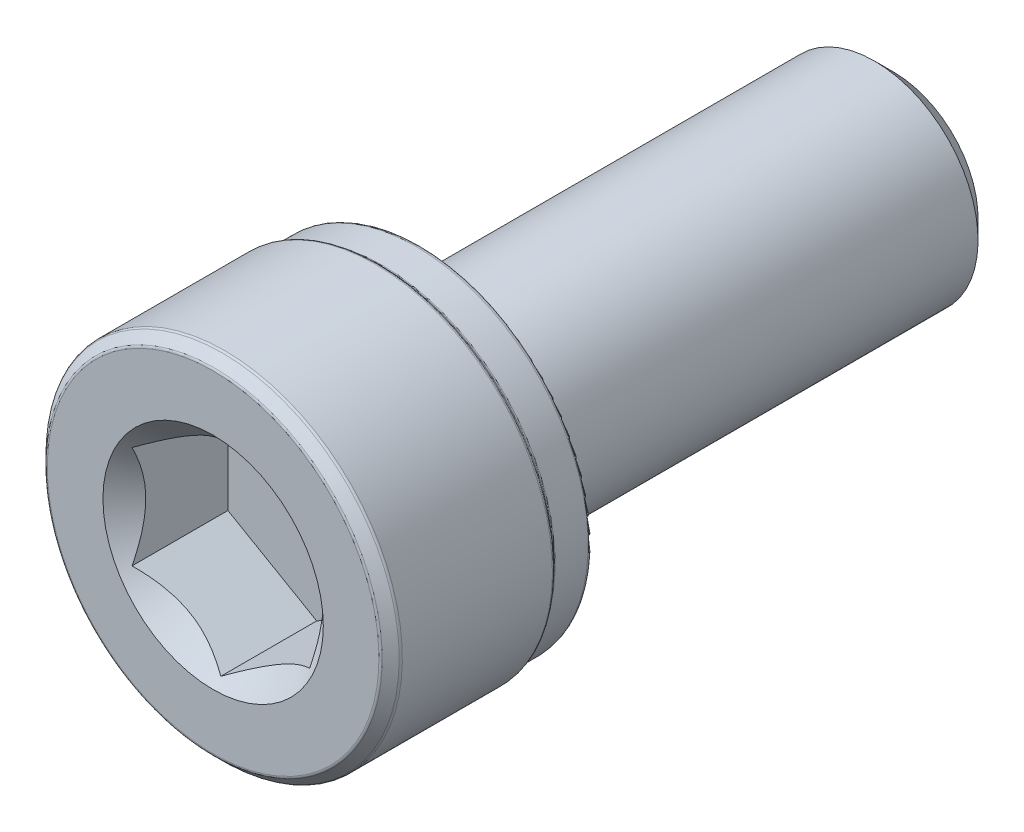
ISO-10303-21;
HEADER;
FILE_DESCRIPTION(('STEP AP214'),'2;1');
FILE_NAME('part.step','',(''),(''),'','','');
FILE_SCHEMA(('AUTOMOTIVE_DESIGN { 1 0 10303 214 1 1 1 1 }'));
ENDSEC;
DATA;
#1=APPLICATION_CONTEXT('core data for automotive mechanical design processes');
#2=APPLICATION_PROTOCOL_DEFINITION('international standard','automotive_design',2000,#1);
#3=PRODUCT_CONTEXT('',#1,'mechanical');
#4=PRODUCT('Part','Part','',(#3));
#5=PRODUCT_RELATED_PRODUCT_CATEGORY('part','',(#4));
#6=PRODUCT_DEFINITION_FORMATION('','',#4);
#7=PRODUCT_DEFINITION_CONTEXT('part definition',#1,'design');
#8=PRODUCT_DEFINITION('design','',#6,#7);
#9=PRODUCT_DEFINITION_SHAPE('','',#8);
#10=(LENGTH_UNIT() NAMED_UNIT(*) SI_UNIT(.MILLI.,.METRE.));
#11=(NAMED_UNIT(*) PLANE_ANGLE_UNIT() SI_UNIT($,.RADIAN.));
#12=(NAMED_UNIT(*) SI_UNIT($,.STERADIAN.) SOLID_ANGLE_UNIT());
#13=UNCERTAINTY_MEASURE_WITH_UNIT(LENGTH_MEASURE(1.E-05),#10,'distance_accuracy_value','');
#14=(GEOMETRIC_REPRESENTATION_CONTEXT(3) GLOBAL_UNCERTAINTY_ASSIGNED_CONTEXT((#13)) GLOBAL_UNIT_ASSIGNED_CONTEXT((#10,
#11,#12)) REPRESENTATION_CONTEXT('',''));
#15=CARTESIAN_POINT('',(0.,0.,0.));
#16=DIRECTION('',(0.,0.,1.));
#17=DIRECTION('',(1.,0.,0.));
#18=AXIS2_PLACEMENT_3D('',#15,#16,#17);
#19=CARTESIAN_POINT('',(0.,2.85048094716168,-11.5));
#20=DIRECTION('',(0.,0.,-1.));
#21=DIRECTION('',(0.,1.,0.));
#22=AXIS2_PLACEMENT_3D('',#19,#20,#21);
#23=PLANE('',#22);
#24=CARTESIAN_POINT('',(0.,0.,-11.5));
#25=DIRECTION('',(0.,0.,-1.));
#26=DIRECTION('',(0.,1.,0.));
#27=AXIS2_PLACEMENT_3D('',#24,#25,#26);
#28=CIRCLE('',#27,2.85048094716168);
#29=CARTESIAN_POINT('',(0.,2.85048094716168,-11.5));
#30=VERTEX_POINT('',#29);
#31=EDGE_CURVE('E12',#30,#30,#28,.T.);
#32=ORIENTED_EDGE('',*,*,#31,.T.);
#33=EDGE_LOOP('',(#32));
#34=FACE_BOUND('',#33,.T.);
#35=ADVANCED_FACE('F40',(#34),#23,.T.);
#36=CARTESIAN_POINT('',(0.,0.,-11.5));
#37=DIRECTION('',(0.,0.,1.));
#38=DIRECTION('',(0.,-1.,0.));
#39=AXIS2_PLACEMENT_3D('',#36,#37,#38);
#40=CONICAL_SURFACE('',#39,2.85048094716168,0.785398163397443);
#41=CARTESIAN_POINT('',(0.,0.,-10.8504809471617));
#42=DIRECTION('',(0.,0.,-1.));
#43=DIRECTION('',(0.,1.,0.));
#44=AXIS2_PLACEMENT_3D('',#41,#42,#43);
#45=CIRCLE('',#44,3.5);
#46=CARTESIAN_POINT('',(0.,3.5,-10.8504809471617));
#47=VERTEX_POINT('',#46);
#48=EDGE_CURVE('E48',#47,#47,#45,.T.);
#49=ORIENTED_EDGE('',*,*,#48,.T.);
#50=EDGE_LOOP('',(#49));
#51=FACE_BOUND('',#50,.T.);
#52=ORIENTED_EDGE('',*,*,#31,.F.);
#53=EDGE_LOOP('',(#52));
#54=FACE_BOUND('',#53,.T.);
#55=ADVANCED_FACE('F178',(#51,#54),#40,.T.);
#56=CARTESIAN_POINT('',(0.,0.,-11.5));
#57=DIRECTION('',(0.,0.,-1.));
#58=DIRECTION('',(0.,1.,0.));
#59=AXIS2_PLACEMENT_3D('',#56,#57,#58);
#60=CYLINDRICAL_SURFACE('',#59,3.5);
#61=CARTESIAN_POINT('',(0.,0.,4.15));
#62=DIRECTION('',(0.,0.,-1.));
#63=DIRECTION('',(0.,1.,0.));
#64=AXIS2_PLACEMENT_3D('',#61,#62,#63);
#65=CIRCLE('',#64,3.5);
#66=CARTESIAN_POINT('',(0.,3.5,4.15));
#67=VERTEX_POINT('',#66);
#68=EDGE_CURVE('E171',#67,#67,#65,.T.);
#69=ORIENTED_EDGE('',*,*,#68,.T.);
#70=EDGE_LOOP('',(#69));
#71=FACE_BOUND('',#70,.T.);
#72=ORIENTED_EDGE('',*,*,#48,.F.);
#73=EDGE_LOOP('',(#72));
#74=FACE_BOUND('',#73,.T.);
#75=ADVANCED_FACE('F181',(#71,#74),#60,.T.);
#76=CARTESIAN_POINT('',(0.,0.,4.15));
#77=DIRECTION('',(0.,0.,-1.));
#78=DIRECTION('',(0.,1.,0.));
#79=AXIS2_PLACEMENT_3D('',#76,#77,#78);
#80=TOROIDAL_SURFACE('',#79,3.85,0.350000000000002);
#81=CARTESIAN_POINT('',(0.,0.,4.5));
#82=DIRECTION('',(0.,0.,-1.));
#83=DIRECTION('',(0.,1.,0.));
#84=AXIS2_PLACEMENT_3D('',#81,#82,#83);
#85=CIRCLE('',#84,3.85);
#86=CARTESIAN_POINT('',(0.,3.85,4.5));
#87=VERTEX_POINT('',#86);
#88=EDGE_CURVE('E167',#87,#87,#85,.T.);
#89=ORIENTED_EDGE('',*,*,#88,.T.);
#90=EDGE_LOOP('',(#89));
#91=FACE_BOUND('',#90,.T.);
#92=ORIENTED_EDGE('',*,*,#68,.F.);
#93=EDGE_LOOP('',(#92));
#94=FACE_BOUND('',#93,.T.);
#95=ADVANCED_FACE('F183',(#91,#94),#80,.F.);
#96=CARTESIAN_POINT('',(0.,5.675,4.5));
#97=DIRECTION('',(0.,0.,-1.));
#98=DIRECTION('',(0.,1.,0.));
#99=AXIS2_PLACEMENT_3D('',#96,#97,#98);
#100=PLANE('',#99);
#101=CARTESIAN_POINT('',(0.,0.,4.5));
#102=DIRECTION('',(0.,0.,-1.));
#103=DIRECTION('',(0.,1.,0.));
#104=AXIS2_PLACEMENT_3D('',#101,#102,#103);
#105=CIRCLE('',#104,5.675);
#106=CARTESIAN_POINT('',(0.,5.675,4.5));
#107=VERTEX_POINT('',#106);
#108=EDGE_CURVE('E163',#107,#107,#105,.T.);
#109=ORIENTED_EDGE('',*,*,#108,.T.);
#110=EDGE_LOOP('',(#109));
#111=FACE_BOUND('',#110,.T.);
#112=ORIENTED_EDGE('',*,*,#88,.F.);
#113=EDGE_LOOP('',(#112));
#114=FACE_BOUND('',#113,.T.);
#115=ADVANCED_FACE('F190',(#111,#114),#100,.T.);
#116=CARTESIAN_POINT('',(0.,0.,4.65));
#117=DIRECTION('',(0.,0.,-1.));
#118=DIRECTION('',(0.,1.,0.));
#119=AXIS2_PLACEMENT_3D('',#116,#117,#118);
#120=TOROIDAL_SURFACE('',#119,5.675,0.15);
#121=CARTESIAN_POINT('',(0.,0.,4.65));
#122=DIRECTION('',(0.,0.,-1.));
#123=DIRECTION('',(0.,1.,0.));
#124=AXIS2_PLACEMENT_3D('',#121,#122,#123);
#125=CIRCLE('',#124,5.825);
#126=CARTESIAN_POINT('',(0.,5.825,4.65));
#127=VERTEX_POINT('',#126);
#128=EDGE_CURVE('E159',#127,#127,#125,.T.);
#129=ORIENTED_EDGE('',*,*,#128,.T.);
#130=EDGE_LOOP('',(#129));
#131=FACE_BOUND('',#130,.T.);
#132=ORIENTED_EDGE('',*,*,#108,.F.);
#133=EDGE_LOOP('',(#132));
#134=FACE_BOUND('',#133,.T.);
#135=ADVANCED_FACE('F221',(#131,#134),#120,.T.);
#136=CARTESIAN_POINT('',(0.,0.,-11.5));
#137=DIRECTION('',(0.,0.,-1.));
#138=DIRECTION('',(0.,1.,0.));
#139=AXIS2_PLACEMENT_3D('',#136,#137,#138);
#140=CYLINDRICAL_SURFACE('',#139,5.825);
#141=CARTESIAN_POINT('',(0.,0.,5.76719539161545));
#142=DIRECTION('',(0.,0.,-1.));
#143=DIRECTION('',(0.,1.,0.));
#144=AXIS2_PLACEMENT_3D('',#141,#142,#143);
#145=CIRCLE('',#144,5.825);
#146=CARTESIAN_POINT('',(0.,5.825,5.76719539161545));
#147=VERTEX_POINT('',#146);
#148=EDGE_CURVE('E155',#147,#147,#145,.T.);
#149=ORIENTED_EDGE('',*,*,#148,.T.);
#150=EDGE_LOOP('',(#149));
#151=FACE_BOUND('',#150,.T.);
#152=ORIENTED_EDGE('',*,*,#128,.F.);
#153=EDGE_LOOP('',(#152));
#154=FACE_BOUND('',#153,.T.);
#155=ADVANCED_FACE('F231',(#151,#154),#140,.T.);
#156=CARTESIAN_POINT('',(0.,0.,5.76719539161545));
#157=DIRECTION('',(0.,0.,-1.));
#158=DIRECTION('',(0.,1.,0.));
#159=AXIS2_PLACEMENT_3D('',#156,#157,#158);
#160=TOROIDAL_SURFACE('',#159,5.934375,0.109374999999999);
#161=CARTESIAN_POINT('',(0.,0.,5.84453519580772));
#162=DIRECTION('',(0.,0.,-1.));
#163=DIRECTION('',(0.,1.,0.));
#164=AXIS2_PLACEMENT_3D('',#161,#162,#163);
#165=CIRCLE('',#164,5.85703519580772);
#166=CARTESIAN_POINT('',(0.,5.85703519580772,5.84453519580772));
#167=VERTEX_POINT('',#166);
#168=EDGE_CURVE('E151',#167,#167,#165,.T.);
#169=ORIENTED_EDGE('',*,*,#168,.T.);
#170=EDGE_LOOP('',(#169));
#171=FACE_BOUND('',#170,.T.);
#172=ORIENTED_EDGE('',*,*,#148,.F.);
#173=EDGE_LOOP('',(#172));
#174=FACE_BOUND('',#173,.T.);
#175=ADVANCED_FACE('F241',(#171,#174),#160,.F.);
#176=CARTESIAN_POINT('',(0.,0.,5.84453519580772));
#177=DIRECTION('',(0.,0.,1.));
#178=DIRECTION('',(0.,-1.,0.));
#179=AXIS2_PLACEMENT_3D('',#176,#177,#178);
#180=CONICAL_SURFACE('',#179,5.85703519580772,0.785398163397437);
#181=CARTESIAN_POINT('',(0.,0.,5.95546480419228));
#182=DIRECTION('',(0.,0.,-1.));
#183=DIRECTION('',(0.,1.,0.));
#184=AXIS2_PLACEMENT_3D('',#181,#182,#183);
#185=CIRCLE('',#184,5.96796480419228);
#186=CARTESIAN_POINT('',(0.,5.96796480419228,5.95546480419228));
#187=VERTEX_POINT('',#186);
#188=EDGE_CURVE('E147',#187,#187,#185,.T.);
#189=ORIENTED_EDGE('',*,*,#188,.T.);
#190=EDGE_LOOP('',(#189));
#191=FACE_BOUND('',#190,.T.);
#192=ORIENTED_EDGE('',*,*,#168,.F.);
#193=EDGE_LOOP('',(#192));
#194=FACE_BOUND('',#193,.T.);
#195=ADVANCED_FACE('F251',(#191,#194),#180,.T.);
#196=CARTESIAN_POINT('',(0.,0.,6.03280460838456));
#197=DIRECTION('',(0.,0.,-1.));
#198=DIRECTION('',(0.,1.,0.));
#199=AXIS2_PLACEMENT_3D('',#196,#197,#198);
#200=TOROIDAL_SURFACE('',#199,5.890625,0.109375);
#201=CARTESIAN_POINT('',(0.,0.,6.03280460838456));
#202=DIRECTION('',(0.,0.,-1.));
#203=DIRECTION('',(0.,1.,0.));
#204=AXIS2_PLACEMENT_3D('',#201,#202,#203);
#205=CIRCLE('',#204,6.);
#206=CARTESIAN_POINT('',(0.,6.,6.03280460838456));
#207=VERTEX_POINT('',#206);
#208=EDGE_CURVE('E143',#207,#207,#205,.T.);
#209=ORIENTED_EDGE('',*,*,#208,.T.);
#210=EDGE_LOOP('',(#209));
#211=FACE_BOUND('',#210,.T.);
#212=ORIENTED_EDGE('',*,*,#188,.F.);
#213=EDGE_LOOP('',(#212));
#214=FACE_BOUND('',#213,.T.);
#215=ADVANCED_FACE('F261',(#211,#214),#200,.T.);
#216=CARTESIAN_POINT('',(0.,0.,-11.5));
#217=DIRECTION('',(0.,0.,-1.));
#218=DIRECTION('',(0.,1.,0.));
#219=AXIS2_PLACEMENT_3D('',#216,#217,#218);
#220=CYLINDRICAL_SURFACE('',#219,6.);
#221=CARTESIAN_POINT('',(0.,0.,11.1046953916154));
#222=DIRECTION('',(0.,0.,-1.));
#223=DIRECTION('',(0.,1.,0.));
#224=AXIS2_PLACEMENT_3D('',#221,#222,#223);
#225=CIRCLE('',#224,6.);
#226=CARTESIAN_POINT('',(0.,6.,11.1046953916154));
#227=VERTEX_POINT('',#226);
#228=EDGE_CURVE('E139',#227,#227,#225,.T.);
#229=ORIENTED_EDGE('',*,*,#228,.T.);
#230=EDGE_LOOP('',(#229));
#231=FACE_BOUND('',#230,.T.);
#232=ORIENTED_EDGE('',*,*,#208,.F.);
#233=EDGE_LOOP('',(#232));
#234=FACE_BOUND('',#233,.T.);
#235=ADVANCED_FACE('F271',(#231,#234),#220,.T.);
#236=CARTESIAN_POINT('',(0.,0.,11.1046953916154));
#237=DIRECTION('',(0.,0.,-1.));
#238=DIRECTION('',(0.,1.,0.));
#239=AXIS2_PLACEMENT_3D('',#236,#237,#238);
#240=TOROIDAL_SURFACE('',#239,5.890625,0.109374999999999);
#241=CARTESIAN_POINT('',(0.,0.,11.1820351958077));
#242=DIRECTION('',(0.,0.,-1.));
#243=DIRECTION('',(0.,1.,0.));
#244=AXIS2_PLACEMENT_3D('',#241,#242,#243);
#245=CIRCLE('',#244,5.96796480419228);
#246=CARTESIAN_POINT('',(0.,5.96796480419228,11.1820351958077));
#247=VERTEX_POINT('',#246);
#248=EDGE_CURVE('E135',#247,#247,#245,.T.);
#249=ORIENTED_EDGE('',*,*,#248,.T.);
#250=EDGE_LOOP('',(#249));
#251=FACE_BOUND('',#250,.T.);
#252=ORIENTED_EDGE('',*,*,#228,.F.);
#253=EDGE_LOOP('',(#252));
#254=FACE_BOUND('',#253,.T.);
#255=ADVANCED_FACE('F281',(#251,#254),#240,.T.);
#256=CARTESIAN_POINT('',(0.,0.,11.1820351958077));
#257=DIRECTION('',(0.,0.,-1.));
#258=DIRECTION('',(0.,1.,0.));
#259=AXIS2_PLACEMENT_3D('',#256,#257,#258);
#260=CONICAL_SURFACE('',#259,5.96796480419228,0.785398163397442);
#261=CARTESIAN_POINT('',(0.,0.,11.4679648041923));
#262=DIRECTION('',(0.,0.,-1.));
#263=DIRECTION('',(0.,1.,0.));
#264=AXIS2_PLACEMENT_3D('',#261,#262,#263);
#265=CIRCLE('',#264,5.68203519580772);
#266=CARTESIAN_POINT('',(0.,5.68203519580772,11.4679648041923));
#267=VERTEX_POINT('',#266);
#268=EDGE_CURVE('E131',#267,#267,#265,.T.);
#269=ORIENTED_EDGE('',*,*,#268,.T.);
#270=EDGE_LOOP('',(#269));
#271=FACE_BOUND('',#270,.T.);
#272=ORIENTED_EDGE('',*,*,#248,.F.);
#273=EDGE_LOOP('',(#272));
#274=FACE_BOUND('',#273,.T.);
#275=ADVANCED_FACE('F291',(#271,#274),#260,.T.);
#276=CARTESIAN_POINT('',(0.,0.,11.390625));
#277=DIRECTION('',(0.,0.,-1.));
#278=DIRECTION('',(0.,1.,0.));
#279=AXIS2_PLACEMENT_3D('',#276,#277,#278);
#280=TOROIDAL_SURFACE('',#279,5.60469539161544,0.109374999999999);
#281=CARTESIAN_POINT('',(0.,0.,11.5));
#282=DIRECTION('',(0.,0.,-1.));
#283=DIRECTION('',(0.,1.,0.));
#284=AXIS2_PLACEMENT_3D('',#281,#282,#283);
#285=CIRCLE('',#284,5.60469539161544);
#286=CARTESIAN_POINT('',(0.,5.60469539161544,11.5));
#287=VERTEX_POINT('',#286);
#288=EDGE_CURVE('E127',#287,#287,#285,.T.);
#289=ORIENTED_EDGE('',*,*,#288,.T.);
#290=EDGE_LOOP('',(#289));
#291=FACE_BOUND('',#290,.T.);
#292=ORIENTED_EDGE('',*,*,#268,.F.);
#293=EDGE_LOOP('',(#292));
#294=FACE_BOUND('',#293,.T.);
#295=ADVANCED_FACE('F301',(#291,#294),#280,.T.);
#296=CARTESIAN_POINT('',(0.,0.,11.5));
#297=DIRECTION('',(0.,0.,1.));
#298=DIRECTION('',(0.,-1.,0.));
#299=AXIS2_PLACEMENT_3D('',#296,#297,#298);
#300=PLANE('',#299);
#301=CARTESIAN_POINT('',(0.,0.,11.5));
#302=DIRECTION('',(0.,0.,1.));
#303=DIRECTION('',(1.,0.,0.));
#304=AXIS2_PLACEMENT_3D('',#301,#302,#303);
#305=CIRCLE('',#304,3.72390923627308);
#306=CARTESIAN_POINT('',(3.72390923627308,0.,11.5));
#307=VERTEX_POINT('',#306);
#308=EDGE_CURVE('E100',#307,#307,#305,.T.);
#309=ORIENTED_EDGE('',*,*,#308,.F.);
#310=EDGE_LOOP('',(#309));
#311=FACE_BOUND('',#310,.T.);
#312=ORIENTED_EDGE('',*,*,#288,.F.);
#313=EDGE_LOOP('',(#312));
#314=FACE_BOUND('',#313,.T.);
#315=ADVANCED_FACE('F311',(#311,#314),#300,.T.);
#316=CARTESIAN_POINT('',(0.,0.,11.5));
#317=DIRECTION('',(0.,0.,1.));
#318=DIRECTION('',(1.,0.,0.));
#319=AXIS2_PLACEMENT_3D('',#316,#317,#318);
#320=CONICAL_SURFACE('',#319,3.72390923627308,0.78539816339745);
#321=ORIENTED_EDGE('',*,*,#308,.T.);
#322=EDGE_LOOP('',(#321));
#323=FACE_BOUND('',#322,.T.);
#324=CARTESIAN_POINT('',(-3.0002,-1.73193533751504,11.2403078546918));
#325=CARTESIAN_POINT('',(-2.89707648504425,-1.79147372663452,11.1808206971865));
#326=CARTESIAN_POINT('',(-2.79222861066935,-1.85200767512883,11.1248273583302));
#327=CARTESIAN_POINT('',(-2.5784323282189,-1.97544301635334,11.0223049752436));
#328=CARTESIAN_POINT('',(-2.46946358862023,-2.03835614749388,10.975832972606));
#329=CARTESIAN_POINT('',(-2.24973336040297,-2.16521745390422,10.896225567381));
#330=CARTESIAN_POINT('',(-2.13902782823778,-2.22913332270056,10.8628900795073));
#331=CARTESIAN_POINT('',(-1.91517958943467,-2.35837216363117,10.811529922844));
#332=CARTESIAN_POINT('',(-1.802043720793,-2.42369118784644,10.7934669164003));
#333=CARTESIAN_POINT('',(-1.60705904380729,-2.53626564359199,10.7771692873152));
#334=CARTESIAN_POINT('',(-1.52546204599786,-2.58337569224233,10.7747567460385));
#335=CARTESIAN_POINT('',(-1.3624007711699,-2.67751916315865,10.7788218135218));
#336=CARTESIAN_POINT('',(-1.28093655070101,-2.72455255277569,10.785302538893));
#337=CARTESIAN_POINT('',(-1.11877988766162,-2.81817374583237,10.8067841013799));
#338=CARTESIAN_POINT('',(-1.03808841121569,-2.86476099147974,10.8217944688319));
#339=CARTESIAN_POINT('',(-0.878091302108659,-2.95713536549225,10.8595160249307));
#340=CARTESIAN_POINT('',(-0.798785563690698,-3.00292255491614,10.8822266231875));
#341=CARTESIAN_POINT('',(-0.657993859197242,-3.0842086834051,10.9289530637186));
#342=CARTESIAN_POINT('',(-0.596196277853969,-3.11988753362891,10.9517407065455));
#343=CARTESIAN_POINT('',(-0.473710582479776,-3.19060468282508,11.0009886649221));
#344=CARTESIAN_POINT('',(-0.413022502364393,-3.22564296221629,11.0274490925309));
#345=CARTESIAN_POINT('',(-0.292947002609134,-3.29496858432307,11.083449373256));
#346=CARTESIAN_POINT('',(-0.233556167704079,-3.3292578988429,11.112979543343));
#347=CARTESIAN_POINT('',(-0.115874438532729,-3.39720147685868,11.1747314704402));
#348=CARTESIAN_POINT('',(-0.0575828957522637,-3.43085611477446,11.206951575524));
#349=CARTESIAN_POINT('',(0.00020000000000167,-3.46421708519159,11.2403078546918));
#350=B_SPLINE_CURVE_WITH_KNOTS('',3,(#324,#325,#326,#327,#328,#329,#330,#331,#332,#333,#334,
#335,#336,#337,#338,#339,#340,#341,#342,#343,#344,#345,#346,#347,#348,#349),.UNSPECIFIED.,.F.,
.F.,(4,2,2,2,2,2,2,2,2,2,2,2,4),(0.,0.399603557139307,0.801535286397846,1.19708369162343,
1.59163620080173,1.87398941755844,2.15644160919093,2.43921001247425,2.72195674032138,
2.94657516661927,3.17120044767274,3.3951375283781,3.61893808380739),.UNSPECIFIED.);
#351=CARTESIAN_POINT('',(-3.,-1.73205080756887,11.2401923788647));
#352=VERTEX_POINT('',#351);
#353=CARTESIAN_POINT('',(0.,-3.46410161513775,11.2401923788647));
#354=VERTEX_POINT('',#353);
#355=EDGE_CURVE('E108',#352,#354,#350,.T.);
#356=ORIENTED_EDGE('',*,*,#355,.F.);
#357=CARTESIAN_POINT('',(-3.,-3.65868502692184,12.5074728161744));
#358=CARTESIAN_POINT('',(-3.,-3.57046001434659,12.4392654022356));
#359=CARTESIAN_POINT('',(-3.,-3.48176466824411,12.3716568866961));
#360=CARTESIAN_POINT('',(-3.,-3.30323929172792,12.2379127141258));
#361=CARTESIAN_POINT('',(-3.,-3.21340900193022,12.1717774036907));
#362=CARTESIAN_POINT('',(-3.,-3.03176386710967,12.04078425691));
#363=CARTESIAN_POINT('',(-3.,-2.93993906622249,11.9759401814366));
#364=CARTESIAN_POINT('',(-3.,-2.75477001311512,11.8484666510655));
#365=CARTESIAN_POINT('',(-3.,-2.66142586552539,11.7858370446016));
#366=CARTESIAN_POINT('',(-3.,-2.4668197301681,11.6593084792421));
#367=CARTESIAN_POINT('',(-3.,-2.36543808558168,11.5955926371686));
#368=CARTESIAN_POINT('',(-3.,-2.16029134446498,11.4720547356373));
#369=CARTESIAN_POINT('',(-3.,-2.05652584459888,11.4122333417624));
#370=CARTESIAN_POINT('',(-3.,-1.84657278864411,11.2977536369836));
#371=CARTESIAN_POINT('',(-3.,-1.74039355395929,11.243080184106));
#372=CARTESIAN_POINT('',(-3.,-1.52500620692437,11.1401214423672));
#373=CARTESIAN_POINT('',(-3.,-1.41579956866436,11.0918331083544));
#374=CARTESIAN_POINT('',(-3.,-1.20555018350108,11.0079710827069));
#375=CARTESIAN_POINT('',(-3.,-1.10482901625482,10.9715993284052));
#376=CARTESIAN_POINT('',(-3.,-0.900782966121197,10.9069144236256));
#377=CARTESIAN_POINT('',(-3.,-0.797457921027949,10.878601776539));
#378=CARTESIAN_POINT('',(-3.,-0.590643649276323,10.8320553377726));
#379=CARTESIAN_POINT('',(-3.,-0.487196993252259,10.8136356037351));
#380=CARTESIAN_POINT('',(-3.,-0.27897031248833,10.7872658158374));
#381=CARTESIAN_POINT('',(-3.,-0.174190583554851,10.7793134788245));
#382=CARTESIAN_POINT('',(-3.,0.0308085290515859,10.7745791049118));
#383=CARTESIAN_POINT('',(-3.,0.131016524095698,10.7773011930421));
#384=CARTESIAN_POINT('',(-3.,0.330669341657684,10.7926169386191));
#385=CARTESIAN_POINT('',(-3.,0.430114095513744,10.8052114739277));
#386=CARTESIAN_POINT('',(-3.,0.629211173128045,10.8397663264938));
#387=CARTESIAN_POINT('',(-3.,0.728834054007884,10.8618936597452));
#388=CARTESIAN_POINT('',(-3.,0.925868222371533,10.9142769115155));
#389=CARTESIAN_POINT('',(-3.,1.02327961830608,10.9445324304921));
#390=CARTESIAN_POINT('',(-3.,1.32135884485001,11.0487225128153));
#391=CARTESIAN_POINT('',(-3.,1.51802051003283,11.1341523863885));
#392=CARTESIAN_POINT('',(-3.,1.80585609935241,11.2766873101988));
#393=CARTESIAN_POINT('',(-3.,1.90078404091317,11.3267074055041));
#394=CARTESIAN_POINT('',(-3.,2.08849313613445,11.4306342448877));
#395=CARTESIAN_POINT('',(-3.,2.18127466149529,11.4845403092663));
#396=CARTESIAN_POINT('',(-3.,2.36041110373359,11.5927256823976));
#397=CARTESIAN_POINT('',(-3.,2.44685732002799,11.646855513939));
#398=CARTESIAN_POINT('',(-3.,2.61826626313253,11.7574261728339));
#399=CARTESIAN_POINT('',(-3.,2.70322887833781,11.8138671729874));
#400=CARTESIAN_POINT('',(-3.,2.87118087576364,11.9281888330549));
#401=CARTESIAN_POINT('',(-3.,2.95418061060259,11.9860543468003));
#402=CARTESIAN_POINT('',(-3.,3.11904059542994,12.1033407654459));
#403=CARTESIAN_POINT('',(-3.,3.20090115330639,12.162761237067));
#404=CARTESIAN_POINT('',(-3.,3.28228390975415,12.2228185116592));
#405=B_SPLINE_CURVE_WITH_KNOTS('',3,(#357,#358,#359,#360,#361,#362,#363,#364,#365,#366,#367,
#368,#369,#370,#371,#372,#373,#374,#375,#376,#377,#378,#379,#380,#381,#382,#383,#384,#385,#386,
#387,#388,#389,#390,#391,#392,#393,#394,#395,#396,#397,#398,#399,#400,#401,#402,#403,#404),
.UNSPECIFIED.,.F.,.F.,(4,2,2,2,2,2,2,2,2,2,2,2,2,2,2,2,2,2,2,2,2,2,2,4),(0.,0.334555166391488,
0.669188228361208,1.00639842533175,1.34358549761277,1.70273944448279,2.06195461248973,
2.42007783772557,2.77802964825103,3.09901554007012,3.420021477043,3.7347616972365,
4.04943325478864,4.34966403239456,4.64992150966994,4.95566830287767,5.26140006979961,
5.90266544708056,6.22453811891991,6.54635462757108,6.85230229494454,7.15827287913397,
7.46179352227316,7.7652304734124),.UNSPECIFIED.);
#406=CARTESIAN_POINT('',(-3.,1.73205080756887,11.2401923788647));
#407=VERTEX_POINT('',#406);
#408=EDGE_CURVE('E435',#407,#352,#405,.F.);
#409=ORIENTED_EDGE('',*,*,#408,.F.);
#410=CARTESIAN_POINT('',(0.000200000000000959,3.46421708519159,11.2403078546918));
#411=CARTESIAN_POINT('',(-0.102923514955748,3.40467869607211,11.1808206971865));
#412=CARTESIAN_POINT('',(-0.20777138933065,3.3441447475778,11.1248273583302));
#413=CARTESIAN_POINT('',(-0.421567671781096,3.22070940635329,11.0223049752436));
#414=CARTESIAN_POINT('',(-0.53053641137976,3.15779627521275,10.975832972606));
#415=CARTESIAN_POINT('',(-0.750266639597028,3.03093496880241,10.896225567381));
#416=CARTESIAN_POINT('',(-0.860972171762212,2.96701910000606,10.8628900795073));
#417=CARTESIAN_POINT('',(-1.08482041056533,2.83778025907546,10.811529922844));
#418=CARTESIAN_POINT('',(-1.19795627920699,2.77246123486019,10.7934669164003));
#419=CARTESIAN_POINT('',(-1.3929409561927,2.65988677911464,10.7771692873152));
#420=CARTESIAN_POINT('',(-1.47453795400213,2.6127767304643,10.7747567460385));
#421=CARTESIAN_POINT('',(-1.63759922883009,2.51863325954797,10.7788218135218));
#422=CARTESIAN_POINT('',(-1.71906344929899,2.47159986993093,10.785302538893));
#423=CARTESIAN_POINT('',(-1.88122011233837,2.37797867687425,10.8067841013799));
#424=CARTESIAN_POINT('',(-1.9619115887843,2.33139143122689,10.8217944688319));
#425=CARTESIAN_POINT('',(-2.12190869789134,2.23901705721438,10.8595160249307));
#426=CARTESIAN_POINT('',(-2.2012144363093,2.19322986779049,10.8822266231875));
#427=CARTESIAN_POINT('',(-2.34200614080275,2.11194373930152,10.9289530637186));
#428=CARTESIAN_POINT('',(-2.40380372214603,2.07626488907772,10.9517407065455));
#429=CARTESIAN_POINT('',(-2.52628941752022,2.00554773988155,11.0009886649221));
#430=CARTESIAN_POINT('',(-2.5869774976356,1.97050946049033,11.0274490925309));
#431=CARTESIAN_POINT('',(-2.70705299739086,1.90118383838355,11.083449373256));
#432=CARTESIAN_POINT('',(-2.76644383229592,1.86689452386372,11.112979543343));
#433=CARTESIAN_POINT('',(-2.88412556146727,1.79895094584794,11.1747314704402));
#434=CARTESIAN_POINT('',(-2.94241710424773,1.76529630793216,11.206951575524));
#435=CARTESIAN_POINT('',(-3.0002,1.73193533751504,11.2403078546918));
#436=B_SPLINE_CURVE_WITH_KNOTS('',3,(#410,#411,#412,#413,#414,#415,#416,#417,#418,#419,#420,
#421,#422,#423,#424,#425,#426,#427,#428,#429,#430,#431,#432,#433,#434,#435),.UNSPECIFIED.,.F.,
.F.,(4,2,2,2,2,2,2,2,2,2,2,2,4),(0.,0.399603557139307,0.801535286397846,1.19708369162343,
1.59163620080173,1.87398941755844,2.15644160919093,2.43921001247425,2.72195674032138,
2.94657516661927,3.17120044767274,3.3951375283781,3.61893808380739),.UNSPECIFIED.);
#437=CARTESIAN_POINT('',(0.,3.46410161513775,11.2401923788647));
#438=VERTEX_POINT('',#437);
#439=EDGE_CURVE('E430',#438,#407,#436,.T.);
#440=ORIENTED_EDGE('',*,*,#439,.F.);
#441=CARTESIAN_POINT('',(3.0002,1.73193533751504,11.2403078546918));
#442=CARTESIAN_POINT('',(2.89707648504425,1.79147372663452,11.1808206971865));
#443=CARTESIAN_POINT('',(2.79222861066935,1.85200767512883,11.1248273583302));
#444=CARTESIAN_POINT('',(2.5784323282189,1.97544301635334,11.0223049752436));
#445=CARTESIAN_POINT('',(2.46946358862024,2.03835614749388,10.975832972606));
#446=CARTESIAN_POINT('',(2.24973336040297,2.16521745390422,10.896225567381));
#447=CARTESIAN_POINT('',(2.13902782823779,2.22913332270057,10.8628900795073));
#448=CARTESIAN_POINT('',(1.91517958943467,2.35837216363117,10.811529922844));
#449=CARTESIAN_POINT('',(1.802043720793,2.42369118784644,10.7934669164003));
#450=CARTESIAN_POINT('',(1.60705904380729,2.53626564359199,10.7771692873152));
#451=CARTESIAN_POINT('',(1.52546204599786,2.58337569224233,10.7747567460385));
#452=CARTESIAN_POINT('',(1.36240077116991,2.67751916315865,10.7788218135218));
#453=CARTESIAN_POINT('',(1.28093655070101,2.7245525527757,10.785302538893));
#454=CARTESIAN_POINT('',(1.11877988766163,2.81817374583237,10.8067841013799));
#455=CARTESIAN_POINT('',(1.03808841121569,2.86476099147974,10.821794468832));
#456=CARTESIAN_POINT('',(0.878091302108661,2.95713536549225,10.8595160249307));
#457=CARTESIAN_POINT('',(0.7987855636907,3.00292255491614,10.8822266231875));
#458=CARTESIAN_POINT('',(0.657993859197243,3.0842086834051,10.9289530637186));
#459=CARTESIAN_POINT('',(0.596196277853971,3.11988753362891,10.9517407065455));
#460=CARTESIAN_POINT('',(0.473710582479778,3.19060468282508,11.0009886649221));
#461=CARTESIAN_POINT('',(0.413022502364394,3.2256429622163,11.0274490925309));
#462=CARTESIAN_POINT('',(0.292947002609136,3.29496858432307,11.083449373256));
#463=CARTESIAN_POINT('',(0.233556167704081,3.3292578988429,11.112979543343));
#464=CARTESIAN_POINT('',(0.115874438532732,3.39720147685868,11.1747314704402));
#465=CARTESIAN_POINT('',(0.057582895752267,3.43085611477446,11.206951575524));
#466=CARTESIAN_POINT('',(-0.000199999999998207,3.46421708519159,11.2403078546918));
#467=B_SPLINE_CURVE_WITH_KNOTS('',3,(#441,#442,#443,#444,#445,#446,#447,#448,#449,#450,#451,
#452,#453,#454,#455,#456,#457,#458,#459,#460,#461,#462,#463,#464,#465,#466),.UNSPECIFIED.,.F.,
.F.,(4,2,2,2,2,2,2,2,2,2,2,2,4),(0.,0.399603557139308,0.801535286397848,1.19708369162343,
1.59163620080173,1.87398941755845,2.15644160919093,2.43921001247426,2.72195674032138,
2.94657516661927,3.17120044767275,3.3951375283781,3.61893808380739),.UNSPECIFIED.);
#468=CARTESIAN_POINT('',(3.,1.73205080756888,11.2401923788647));
#469=VERTEX_POINT('',#468);
#470=EDGE_CURVE('E55',#469,#438,#467,.T.);
#471=ORIENTED_EDGE('',*,*,#470,.F.);
#472=CARTESIAN_POINT('',(3.,-3.65868568542365,12.507473325381));
#473=CARTESIAN_POINT('',(3.,-3.57046065370778,12.4392658917112));
#474=CARTESIAN_POINT('',(3.,-3.48176528840875,12.3716573564685));
#475=CARTESIAN_POINT('',(3.,-3.30323987331902,12.2379131446039));
#476=CARTESIAN_POINT('',(3.,-3.21340956414427,12.1717778145777));
#477=CARTESIAN_POINT('',(3.,-3.03176438993655,12.0407846284677));
#478=CARTESIAN_POINT('',(3.,-2.93993956903388,11.9759405332623));
#479=CARTESIAN_POINT('',(3.,-2.75477047555453,11.8484669637312));
#480=CARTESIAN_POINT('',(3.,-2.66142630760835,11.7858373378394));
#481=CARTESIAN_POINT('',(3.,-2.4668201282923,11.6593087319058));
#482=CARTESIAN_POINT('',(3.,-2.36543846004299,11.5955928687615));
#483=CARTESIAN_POINT('',(3.,-2.16029167076655,11.472054926036));
#484=CARTESIAN_POINT('',(3.,-2.05652614640319,11.4122335120383));
#485=CARTESIAN_POINT('',(3.,-1.8465730405795,11.2977537686578));
#486=CARTESIAN_POINT('',(3.,-1.74039378053025,11.2430802972896));
#487=CARTESIAN_POINT('',(3.,-1.52500638138399,11.1401215208862));
#488=CARTESIAN_POINT('',(3.,-1.41579971637871,11.0918331706963));
#489=CARTESIAN_POINT('',(3.,-1.20555032006933,11.0079711341128));
#490=CARTESIAN_POINT('',(3.,-1.10482916967515,10.9715993819958));
#491=CARTESIAN_POINT('',(3.,-0.90078315391948,10.9069144782102));
#492=CARTESIAN_POINT('',(3.,-0.797458126351431,10.8786018299348));
#493=CARTESIAN_POINT('',(3.,-0.590643889129612,10.8320553847186));
#494=CARTESIAN_POINT('',(3.,-0.487197250095804,10.8136356455382));
#495=CARTESIAN_POINT('',(3.,-0.27897060288237,10.7872658433507));
#496=CARTESIAN_POINT('',(3.,-0.174190890509143,10.7793134971926));
#497=CARTESIAN_POINT('',(3.,0.0308081943873898,10.7745791018755));
#498=CARTESIAN_POINT('',(3.,0.131016178238977,10.7773011782611));
#499=CARTESIAN_POINT('',(3.,0.330668974714498,10.7926168987136));
#500=CARTESIAN_POINT('',(3.,0.430113718676848,10.8052114206408));
#501=CARTESIAN_POINT('',(3.,0.629210776765425,10.8397662453486));
#502=CARTESIAN_POINT('',(3.,0.728833648050105,10.8618935640327));
#503=CARTESIAN_POINT('',(3.,0.925867798281236,10.9142767865526));
#504=CARTESIAN_POINT('',(3.,1.02327918567827,10.9445322908464));
#505=CARTESIAN_POINT('',(3.,1.32135832078604,11.0487223052458));
#506=CARTESIAN_POINT('',(3.,1.51801990763497,11.1341521165491));
#507=CARTESIAN_POINT('',(3.,1.8058553841991,11.2766869418376));
#508=CARTESIAN_POINT('',(3.,1.90078328883735,11.3267070033408));
#509=CARTESIAN_POINT('',(3.,2.08849231140504,11.4306337740223));
#510=CARTESIAN_POINT('',(3.,2.18127380103436,11.4845398035015));
#511=CARTESIAN_POINT('',(3.,2.36041017845484,11.5927251104002));
#512=CARTESIAN_POINT('',(3.,2.44685636554216,11.6468549107682));
#513=CARTESIAN_POINT('',(3.,2.61826525065149,11.7574255071813));
#514=CARTESIAN_POINT('',(3.,2.70322783706868,11.8138664760264));
#515=CARTESIAN_POINT('',(3.,2.87117977762098,11.9281880738328));
#516=CARTESIAN_POINT('',(3.,2.95417948436934,11.9860535566299));
#517=CARTESIAN_POINT('',(3.,3.11903941320167,12.1033399134182));
#518=CARTESIAN_POINT('',(3.,3.20089994317372,12.1627603541304));
#519=CARTESIAN_POINT('',(3.,3.28228267176515,12.2228175978567));
#520=B_SPLINE_CURVE_WITH_KNOTS('',3,(#472,#473,#474,#475,#476,#477,#478,#479,#480,#481,#482,
#483,#484,#485,#486,#487,#488,#489,#490,#491,#492,#493,#494,#495,#496,#497,#498,#499,#500,#501,
#502,#503,#504,#505,#506,#507,#508,#509,#510,#511,#512,#513,#514,#515,#516,#517,#518,#519),
.UNSPECIFIED.,.F.,.F.,(4,2,2,2,2,2,2,2,2,2,2,2,2,2,2,2,2,2,2,2,2,2,2,4),(0.,0.33455524802587,
0.669188391653858,1.00639867181903,1.3435858272818,1.70273986787676,2.06195512966582,
2.42007844788624,2.77803035123907,3.09901619346749,3.42002208093526,3.73476225395386,
4.04943376435917,4.34966450759512,4.64992195045385,4.95566870609693,5.26140043546953,
5.90266552412361,6.22453805065167,6.54635441405245,6.85230195751929,7.1582724177938,
7.46179293869819,7.76522976761318),.UNSPECIFIED.);
#521=CARTESIAN_POINT('',(3.,-1.73205080756887,11.2401923788647));
#522=VERTEX_POINT('',#521);
#523=EDGE_CURVE('E92',#522,#469,#520,.T.);
#524=ORIENTED_EDGE('',*,*,#523,.F.);
#525=CARTESIAN_POINT('',(-0.000199999999998448,-3.46421708519159,11.2403078546918));
#526=CARTESIAN_POINT('',(0.10292351495575,-3.40467869607211,11.1808206971865));
#527=CARTESIAN_POINT('',(0.207771389330652,-3.3441447475778,11.1248273583302));
#528=CARTESIAN_POINT('',(0.421567671781098,-3.22070940635329,11.0223049752436));
#529=CARTESIAN_POINT('',(0.530536411379762,-3.15779627521275,10.975832972606));
#530=CARTESIAN_POINT('',(0.75026663959703,-3.03093496880241,10.896225567381));
#531=CARTESIAN_POINT('',(0.860972171762213,-2.96701910000606,10.8628900795073));
#532=CARTESIAN_POINT('',(1.08482041056533,-2.83778025907546,10.811529922844));
#533=CARTESIAN_POINT('',(1.19795627920699,-2.77246123486019,10.7934669164003));
#534=CARTESIAN_POINT('',(1.3929409561927,-2.65988677911464,10.7771692873152));
#535=CARTESIAN_POINT('',(1.47453795400214,-2.6127767304643,10.7747567460385));
#536=CARTESIAN_POINT('',(1.63759922883009,-2.51863325954797,10.7788218135218));
#537=CARTESIAN_POINT('',(1.71906344929899,-2.47159986993093,10.785302538893));
#538=CARTESIAN_POINT('',(1.88122011233837,-2.37797867687425,10.8067841013799));
#539=CARTESIAN_POINT('',(1.9619115887843,-2.33139143122689,10.8217944688319));
#540=CARTESIAN_POINT('',(2.12190869789134,-2.23901705721438,10.8595160249307));
#541=CARTESIAN_POINT('',(2.2012144363093,-2.19322986779049,10.8822266231875));
#542=CARTESIAN_POINT('',(2.34200614080275,-2.11194373930152,10.9289530637186));
#543=CARTESIAN_POINT('',(2.40380372214603,-2.07626488907772,10.9517407065455));
#544=CARTESIAN_POINT('',(2.52628941752022,-2.00554773988155,11.0009886649221));
#545=CARTESIAN_POINT('',(2.5869774976356,-1.97050946049033,11.0274490925309));
#546=CARTESIAN_POINT('',(2.70705299739086,-1.90118383838355,11.083449373256));
#547=CARTESIAN_POINT('',(2.76644383229592,-1.86689452386372,11.112979543343));
#548=CARTESIAN_POINT('',(2.88412556146727,-1.79895094584794,11.1747314704402));
#549=CARTESIAN_POINT('',(2.94241710424774,-1.76529630793216,11.206951575524));
#550=CARTESIAN_POINT('',(3.0002,-1.73193533751503,11.2403078546918));
#551=B_SPLINE_CURVE_WITH_KNOTS('',3,(#525,#526,#527,#528,#529,#530,#531,#532,#533,#534,#535,
#536,#537,#538,#539,#540,#541,#542,#543,#544,#545,#546,#547,#548,#549,#550),.UNSPECIFIED.,.F.,
.F.,(4,2,2,2,2,2,2,2,2,2,2,2,4),(0.,0.399603557139306,0.801535286397845,1.19708369162343,
1.59163620080173,1.87398941755844,2.15644160919093,2.43921001247425,2.72195674032138,
2.94657516661927,3.17120044767274,3.3951375283781,3.61893808380739),.UNSPECIFIED.);
#552=EDGE_CURVE('E95',#354,#522,#551,.T.);
#553=ORIENTED_EDGE('',*,*,#552,.F.);
#554=EDGE_LOOP('',(#356,#409,#440,#471,#524,#553));
#555=FACE_BOUND('',#554,.T.);
#556=ADVANCED_FACE('F94',(#323,#555),#320,.F.);
#557=CARTESIAN_POINT('',(0.,0.,8.));
#558=DIRECTION('',(0.,0.,1.));
#559=DIRECTION('',(1.,0.,0.));
#560=AXIS2_PLACEMENT_3D('',#557,#558,#559);
#561=PLANE('',#560);
#562=DIRECTION('',(0.866025403784438,0.5,0.));
#563=VECTOR('',#562,1.);
#564=CARTESIAN_POINT('',(0.,-3.46410161513775,8.));
#565=LINE('',#564,#563);
#566=CARTESIAN_POINT('',(0.,-3.46410161513775,8.));
#567=VERTEX_POINT('',#566);
#568=CARTESIAN_POINT('',(3.,-1.73205080756887,8.));
#569=VERTEX_POINT('',#568);
#570=EDGE_CURVE('E107',#567,#569,#565,.T.);
#571=ORIENTED_EDGE('',*,*,#570,.T.);
#572=DIRECTION('',(0.,1.,0.));
#573=VECTOR('',#572,1.);
#574=CARTESIAN_POINT('',(3.,-1.73205080756887,8.));
#575=LINE('',#574,#573);
#576=CARTESIAN_POINT('',(3.,1.73205080756888,8.));
#577=VERTEX_POINT('',#576);
#578=EDGE_CURVE('E112',#569,#577,#575,.T.);
#579=ORIENTED_EDGE('',*,*,#578,.T.);
#580=DIRECTION('',(-0.866025403784439,0.5,0.));
#581=VECTOR('',#580,1.);
#582=CARTESIAN_POINT('',(3.,1.73205080756888,8.));
#583=LINE('',#582,#581);
#584=CARTESIAN_POINT('',(0.,3.46410161513775,8.));
#585=VERTEX_POINT('',#584);
#586=EDGE_CURVE('E473',#577,#585,#583,.T.);
#587=ORIENTED_EDGE('',*,*,#586,.T.);
#588=DIRECTION('',(-0.866025403784438,-0.5,0.));
#589=VECTOR('',#588,1.);
#590=CARTESIAN_POINT('',(0.,3.46410161513775,8.));
#591=LINE('',#590,#589);
#592=CARTESIAN_POINT('',(-3.,1.73205080756887,8.));
#593=VERTEX_POINT('',#592);
#594=EDGE_CURVE('E456',#585,#593,#591,.T.);
#595=ORIENTED_EDGE('',*,*,#594,.T.);
#596=DIRECTION('',(0.,-1.,0.));
#597=VECTOR('',#596,1.);
#598=CARTESIAN_POINT('',(-3.,1.73205080756887,8.));
#599=LINE('',#598,#597);
#600=CARTESIAN_POINT('',(-3.,-1.73205080756888,8.));
#601=VERTEX_POINT('',#600);
#602=EDGE_CURVE('E123',#593,#601,#599,.T.);
#603=ORIENTED_EDGE('',*,*,#602,.T.);
#604=DIRECTION('',(0.866025403784439,-0.5,0.));
#605=VECTOR('',#604,1.);
#606=CARTESIAN_POINT('',(-3.,-1.73205080756888,8.));
#607=LINE('',#606,#605);
#608=EDGE_CURVE('E116',#601,#567,#607,.T.);
#609=ORIENTED_EDGE('',*,*,#608,.T.);
#610=EDGE_LOOP('',(#571,#579,#587,#595,#603,#609));
#611=FACE_BOUND('',#610,.T.);
#612=ADVANCED_FACE('F331',(#611),#561,.T.);
#613=CARTESIAN_POINT('',(3.,-1.73205080756887,8.));
#614=DIRECTION('',(1.,0.,0.));
#615=DIRECTION('',(0.,1.,0.));
#616=AXIS2_PLACEMENT_3D('',#613,#614,#615);
#617=PLANE('',#616);
#618=DIRECTION('',(0.,0.,1.));
#619=VECTOR('',#618,1.);
#620=CARTESIAN_POINT('',(3.,-1.73205080756887,8.));
#621=LINE('',#620,#619);
#622=EDGE_CURVE('E104',#569,#522,#621,.T.);
#623=ORIENTED_EDGE('',*,*,#622,.T.);
#624=ORIENTED_EDGE('',*,*,#523,.T.);
#625=DIRECTION('',(0.,0.,1.));
#626=VECTOR('',#625,1.);
#627=CARTESIAN_POINT('',(3.,1.73205080756888,8.));
#628=LINE('',#627,#626);
#629=EDGE_CURVE('E115',#577,#469,#628,.T.);
#630=ORIENTED_EDGE('',*,*,#629,.F.);
#631=ORIENTED_EDGE('',*,*,#578,.F.);
#632=EDGE_LOOP('',(#623,#624,#630,#631));
#633=FACE_BOUND('',#632,.T.);
#634=ADVANCED_FACE('F110',(#633),#617,.F.);
#635=CARTESIAN_POINT('',(3.,1.73205080756888,8.));
#636=DIRECTION('',(0.5,0.866025403784439,0.));
#637=DIRECTION('',(-0.866025403784439,0.5,0.));
#638=AXIS2_PLACEMENT_3D('',#635,#636,#637);
#639=PLANE('',#638);
#640=ORIENTED_EDGE('',*,*,#629,.T.);
#641=ORIENTED_EDGE('',*,*,#470,.T.);
#642=DIRECTION('',(0.,0.,1.));
#643=VECTOR('',#642,1.);
#644=CARTESIAN_POINT('',(0.,3.46410161513775,8.));
#645=LINE('',#644,#643);
#646=EDGE_CURVE('E120',#585,#438,#645,.T.);
#647=ORIENTED_EDGE('',*,*,#646,.F.);
#648=ORIENTED_EDGE('',*,*,#586,.F.);
#649=EDGE_LOOP('',(#640,#641,#647,#648));
#650=FACE_BOUND('',#649,.T.);
#651=ADVANCED_FACE('F350',(#650),#639,.F.);
#652=CARTESIAN_POINT('',(0.,3.46410161513775,8.));
#653=DIRECTION('',(-0.5,0.866025403784438,0.));
#654=DIRECTION('',(-0.866025403784439,-0.5,0.));
#655=AXIS2_PLACEMENT_3D('',#652,#653,#654);
#656=PLANE('',#655);
#657=ORIENTED_EDGE('',*,*,#646,.T.);
#658=ORIENTED_EDGE('',*,*,#439,.T.);
#659=DIRECTION('',(0.,0.,1.));
#660=VECTOR('',#659,1.);
#661=CARTESIAN_POINT('',(-3.,1.73205080756887,8.));
#662=LINE('',#661,#660);
#663=EDGE_CURVE('E459',#593,#407,#662,.T.);
#664=ORIENTED_EDGE('',*,*,#663,.F.);
#665=ORIENTED_EDGE('',*,*,#594,.F.);
#666=EDGE_LOOP('',(#657,#658,#664,#665));
#667=FACE_BOUND('',#666,.T.);
#668=ADVANCED_FACE('F359',(#667),#656,.F.);
#669=CARTESIAN_POINT('',(-3.,1.73205080756887,8.));
#670=DIRECTION('',(-1.,0.,0.));
#671=DIRECTION('',(0.,-1.,0.));
#672=AXIS2_PLACEMENT_3D('',#669,#670,#671);
#673=PLANE('',#672);
#674=ORIENTED_EDGE('',*,*,#663,.T.);
#675=ORIENTED_EDGE('',*,*,#408,.T.);
#676=DIRECTION('',(0.,0.,1.));
#677=VECTOR('',#676,1.);
#678=CARTESIAN_POINT('',(-3.,-1.73205080756888,8.));
#679=LINE('',#678,#677);
#680=EDGE_CURVE('E461',#601,#352,#679,.T.);
#681=ORIENTED_EDGE('',*,*,#680,.F.);
#682=ORIENTED_EDGE('',*,*,#602,.F.);
#683=EDGE_LOOP('',(#674,#675,#681,#682));
#684=FACE_BOUND('',#683,.T.);
#685=ADVANCED_FACE('F369',(#684),#673,.F.);
#686=CARTESIAN_POINT('',(-3.,-1.73205080756888,8.));
#687=DIRECTION('',(-0.5,-0.866025403784439,0.));
#688=DIRECTION('',(0.866025403784439,-0.5,0.));
#689=AXIS2_PLACEMENT_3D('',#686,#687,#688);
#690=PLANE('',#689);
#691=ORIENTED_EDGE('',*,*,#680,.T.);
#692=ORIENTED_EDGE('',*,*,#355,.T.);
#693=DIRECTION('',(0.,0.,1.));
#694=VECTOR('',#693,1.);
#695=CARTESIAN_POINT('',(0.,-3.46410161513775,8.));
#696=LINE('',#695,#694);
#697=EDGE_CURVE('E63',#567,#354,#696,.T.);
#698=ORIENTED_EDGE('',*,*,#697,.F.);
#699=ORIENTED_EDGE('',*,*,#608,.F.);
#700=EDGE_LOOP('',(#691,#692,#698,#699));
#701=FACE_BOUND('',#700,.T.);
#702=ADVANCED_FACE('F379',(#701),#690,.F.);
#703=CARTESIAN_POINT('',(0.,-3.46410161513775,8.));
#704=DIRECTION('',(0.5,-0.866025403784438,0.));
#705=DIRECTION('',(0.866025403784439,0.5,0.));
#706=AXIS2_PLACEMENT_3D('',#703,#704,#705);
#707=PLANE('',#706);
#708=ORIENTED_EDGE('',*,*,#697,.T.);
#709=ORIENTED_EDGE('',*,*,#552,.T.);
#710=ORIENTED_EDGE('',*,*,#622,.F.);
#711=ORIENTED_EDGE('',*,*,#570,.F.);
#712=EDGE_LOOP('',(#708,#709,#710,#711));
#713=FACE_BOUND('',#712,.T.);
#714=ADVANCED_FACE('F103',(#713),#707,.F.);
#715=CLOSED_SHELL('',(#35,#55,#75,#95,#115,#135,#155,#175,#195,#215,#235,#255,#275,#295,#315,
#556,#612,#634,#651,#668,#685,#702,#714));
#716=MANIFOLD_SOLID_BREP('B2',#715);
#717=ADVANCED_BREP_SHAPE_REPRESENTATION('',(#18,#716),#14);
#718=SHAPE_DEFINITION_REPRESENTATION(#9,#717);
ENDSEC;
END-ISO-10303-21;
